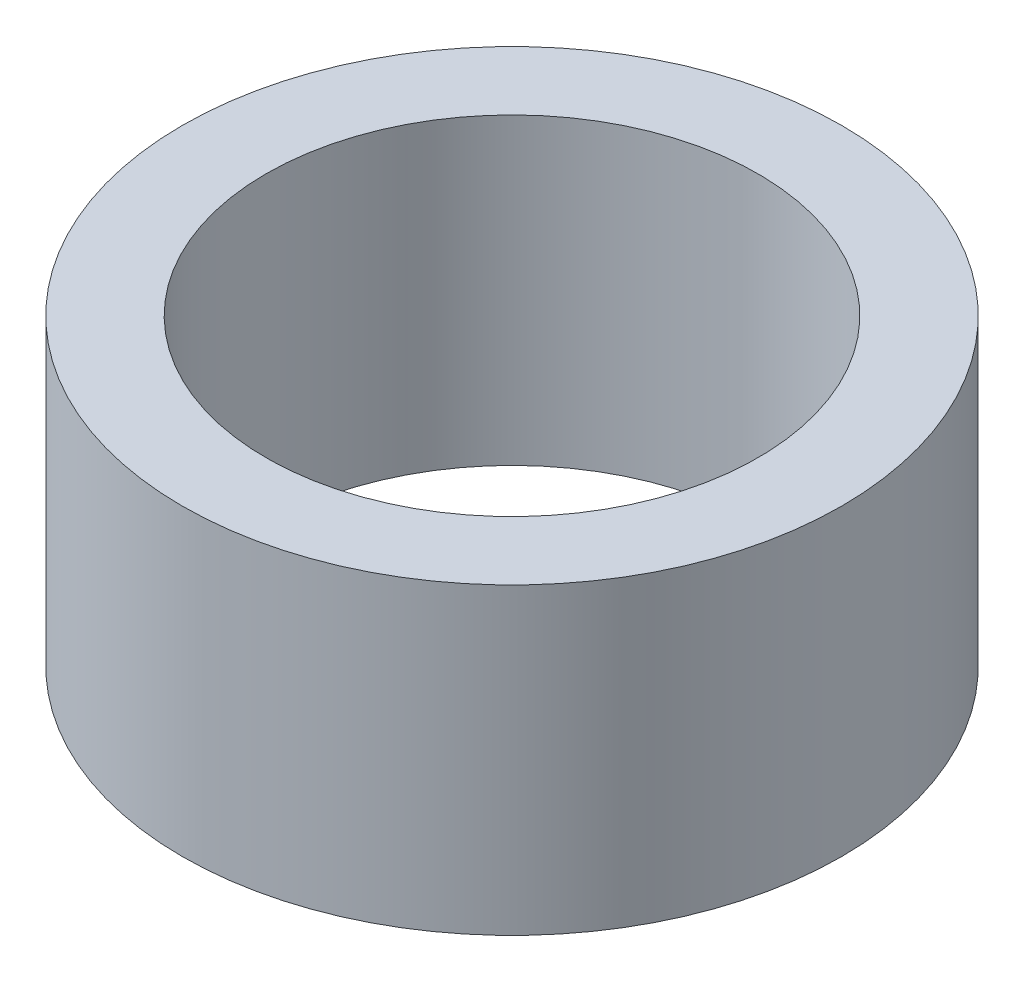
ISO-10303-21;
HEADER;
FILE_DESCRIPTION(('STEP AP214'),'2;1');
FILE_NAME('part.step','',(''),(''),'','','');
FILE_SCHEMA(('AUTOMOTIVE_DESIGN { 1 0 10303 214 1 1 1 1 }'));
ENDSEC;
DATA;
#1=APPLICATION_CONTEXT('core data for automotive mechanical design processes');
#2=APPLICATION_PROTOCOL_DEFINITION('international standard','automotive_design',2000,#1);
#3=PRODUCT_CONTEXT('',#1,'mechanical');
#4=PRODUCT('Part','Part','',(#3));
#5=PRODUCT_RELATED_PRODUCT_CATEGORY('part','',(#4));
#6=PRODUCT_DEFINITION_FORMATION('','',#4);
#7=PRODUCT_DEFINITION_CONTEXT('part definition',#1,'design');
#8=PRODUCT_DEFINITION('design','',#6,#7);
#9=PRODUCT_DEFINITION_SHAPE('','',#8);
#10=(LENGTH_UNIT() NAMED_UNIT(*) SI_UNIT(.MILLI.,.METRE.));
#11=(NAMED_UNIT(*) PLANE_ANGLE_UNIT() SI_UNIT($,.RADIAN.));
#12=(NAMED_UNIT(*) SI_UNIT($,.STERADIAN.) SOLID_ANGLE_UNIT());
#13=UNCERTAINTY_MEASURE_WITH_UNIT(LENGTH_MEASURE(1.E-05),#10,'distance_accuracy_value','');
#14=(GEOMETRIC_REPRESENTATION_CONTEXT(3) GLOBAL_UNCERTAINTY_ASSIGNED_CONTEXT((#13)) GLOBAL_UNIT_ASSIGNED_CONTEXT((#10,
#11,#12)) REPRESENTATION_CONTEXT('',''));
#15=CARTESIAN_POINT('',(0.,0.,0.));
#16=DIRECTION('',(0.,0.,1.));
#17=DIRECTION('',(1.,0.,0.));
#18=AXIS2_PLACEMENT_3D('',#15,#16,#17);
#19=CARTESIAN_POINT('',(0.,208.644912311769,0.));
#20=DIRECTION('',(0.,1.,0.));
#21=DIRECTION('',(-1.,0.,0.));
#22=AXIS2_PLACEMENT_3D('',#19,#20,#21);
#23=CYLINDRICAL_SURFACE('',#22,4.7);
#24=CARTESIAN_POINT('',(0.,147.749741533289,0.));
#25=DIRECTION('',(0.,1.,0.));
#26=DIRECTION('',(-1.,0.,0.));
#27=AXIS2_PLACEMENT_3D('',#24,#25,#26);
#28=CIRCLE('',#27,4.7);
#29=CARTESIAN_POINT('',(-4.70000000000002,147.749741533289,0.));
#30=VERTEX_POINT('',#29);
#31=EDGE_CURVE('E44',#30,#30,#28,.T.);
#32=ORIENTED_EDGE('',*,*,#31,.F.);
#33=EDGE_LOOP('',(#32));
#34=FACE_BOUND('',#33,.T.);
#35=CARTESIAN_POINT('',(0.,153.549741533289,0.));
#36=DIRECTION('',(0.,1.,0.));
#37=DIRECTION('',(-1.,0.,0.));
#38=AXIS2_PLACEMENT_3D('',#35,#36,#37);
#39=CIRCLE('',#38,4.7);
#40=CARTESIAN_POINT('',(-4.70000000000002,153.549741533289,0.));
#41=VERTEX_POINT('',#40);
#42=EDGE_CURVE('E10',#41,#41,#39,.T.);
#43=ORIENTED_EDGE('',*,*,#42,.T.);
#44=EDGE_LOOP('',(#43));
#45=FACE_BOUND('',#44,.T.);
#46=ADVANCED_FACE('F30',(#34,#45),#23,.F.);
#47=CARTESIAN_POINT('',(4.69999999999998,153.549741533289,0.));
#48=DIRECTION('',(0.,-1.,0.));
#49=DIRECTION('',(1.,0.,0.));
#50=AXIS2_PLACEMENT_3D('',#47,#48,#49);
#51=PLANE('',#50);
#52=ORIENTED_EDGE('',*,*,#42,.F.);
#53=EDGE_LOOP('',(#52));
#54=FACE_BOUND('',#53,.T.);
#55=CARTESIAN_POINT('',(0.,153.549741533289,0.));
#56=DIRECTION('',(0.,1.,0.));
#57=DIRECTION('',(-1.,0.,0.));
#58=AXIS2_PLACEMENT_3D('',#55,#56,#57);
#59=CIRCLE('',#58,6.29999999999999);
#60=CARTESIAN_POINT('',(-6.30000000000001,153.549741533289,0.));
#61=VERTEX_POINT('',#60);
#62=EDGE_CURVE('E36',#61,#61,#59,.T.);
#63=ORIENTED_EDGE('',*,*,#62,.T.);
#64=EDGE_LOOP('',(#63));
#65=FACE_BOUND('',#64,.T.);
#66=ADVANCED_FACE('F53',(#54,#65),#51,.F.);
#67=CARTESIAN_POINT('',(0.,208.644912311769,0.));
#68=DIRECTION('',(0.,1.,0.));
#69=DIRECTION('',(-1.,0.,0.));
#70=AXIS2_PLACEMENT_3D('',#67,#68,#69);
#71=CYLINDRICAL_SURFACE('',#70,6.29999999999999);
#72=ORIENTED_EDGE('',*,*,#62,.F.);
#73=EDGE_LOOP('',(#72));
#74=FACE_BOUND('',#73,.T.);
#75=CARTESIAN_POINT('',(0.,147.749741533289,0.));
#76=DIRECTION('',(0.,1.,0.));
#77=DIRECTION('',(-1.,0.,0.));
#78=AXIS2_PLACEMENT_3D('',#75,#76,#77);
#79=CIRCLE('',#78,6.29999999999999);
#80=CARTESIAN_POINT('',(-6.30000000000001,147.749741533289,0.));
#81=VERTEX_POINT('',#80);
#82=EDGE_CURVE('E40',#81,#81,#79,.T.);
#83=ORIENTED_EDGE('',*,*,#82,.T.);
#84=EDGE_LOOP('',(#83));
#85=FACE_BOUND('',#84,.T.);
#86=ADVANCED_FACE('F57',(#74,#85),#71,.T.);
#87=CARTESIAN_POINT('',(4.69999999999998,147.749741533289,0.));
#88=DIRECTION('',(0.,1.,0.));
#89=DIRECTION('',(-1.,0.,0.));
#90=AXIS2_PLACEMENT_3D('',#87,#88,#89);
#91=PLANE('',#90);
#92=ORIENTED_EDGE('',*,*,#82,.F.);
#93=EDGE_LOOP('',(#92));
#94=FACE_BOUND('',#93,.T.);
#95=ORIENTED_EDGE('',*,*,#31,.T.);
#96=EDGE_LOOP('',(#95));
#97=FACE_BOUND('',#96,.T.);
#98=ADVANCED_FACE('F50',(#94,#97),#91,.F.);
#99=CLOSED_SHELL('',(#46,#66,#86,#98));
#100=MANIFOLD_SOLID_BREP('B2',#99);
#101=ADVANCED_BREP_SHAPE_REPRESENTATION('',(#18,#100),#14);
#102=SHAPE_DEFINITION_REPRESENTATION(#9,#101);
ENDSEC;
END-ISO-10303-21;
